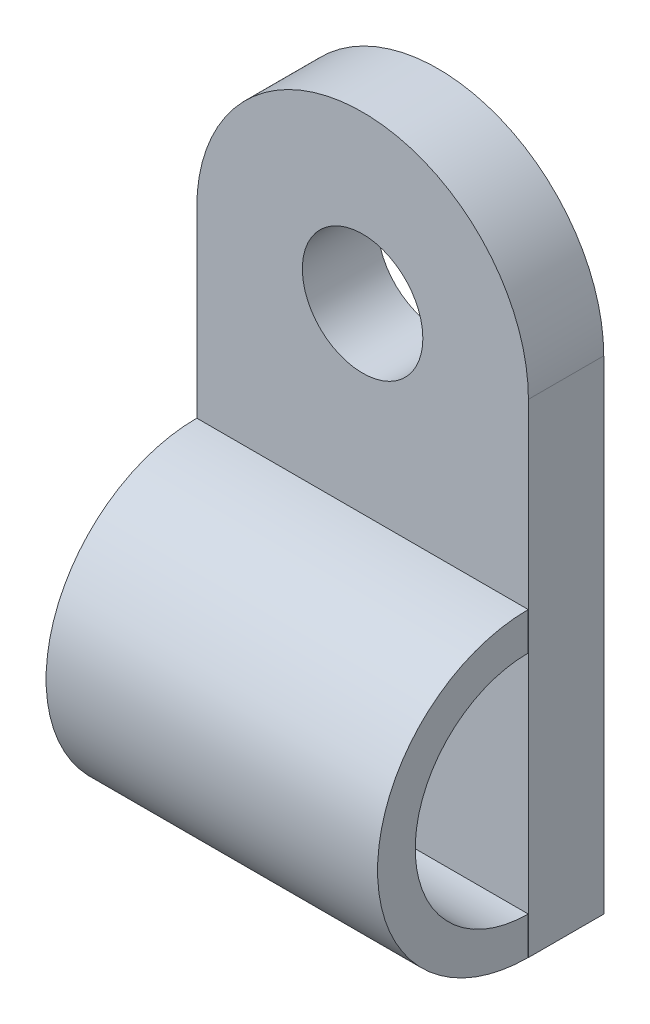
ISO-10303-21;
HEADER;
FILE_DESCRIPTION(('STEP AP214'),'2;1');
FILE_NAME('part.step','',(''),(''),'','','');
FILE_SCHEMA(('AUTOMOTIVE_DESIGN { 1 0 10303 214 1 1 1 1 }'));
ENDSEC;
DATA;
#1=APPLICATION_CONTEXT('core data for automotive mechanical design processes');
#2=APPLICATION_PROTOCOL_DEFINITION('international standard','automotive_design',2000,#1);
#3=PRODUCT_CONTEXT('',#1,'mechanical');
#4=PRODUCT('Part','Part','',(#3));
#5=PRODUCT_RELATED_PRODUCT_CATEGORY('part','',(#4));
#6=PRODUCT_DEFINITION_FORMATION('','',#4);
#7=PRODUCT_DEFINITION_CONTEXT('part definition',#1,'design');
#8=PRODUCT_DEFINITION('design','',#6,#7);
#9=PRODUCT_DEFINITION_SHAPE('','',#8);
#10=(LENGTH_UNIT() NAMED_UNIT(*) SI_UNIT(.MILLI.,.METRE.));
#11=(NAMED_UNIT(*) PLANE_ANGLE_UNIT() SI_UNIT($,.RADIAN.));
#12=(NAMED_UNIT(*) SI_UNIT($,.STERADIAN.) SOLID_ANGLE_UNIT());
#13=UNCERTAINTY_MEASURE_WITH_UNIT(LENGTH_MEASURE(1.E-05),#10,'distance_accuracy_value','');
#14=(GEOMETRIC_REPRESENTATION_CONTEXT(3) GLOBAL_UNCERTAINTY_ASSIGNED_CONTEXT((#13)) GLOBAL_UNIT_ASSIGNED_CONTEXT((#10,
#11,#12)) REPRESENTATION_CONTEXT('',''));
#15=CARTESIAN_POINT('',(0.,0.,0.));
#16=DIRECTION('',(0.,0.,1.));
#17=DIRECTION('',(1.,0.,0.));
#18=AXIS2_PLACEMENT_3D('',#15,#16,#17);
#19=CARTESIAN_POINT('',(0.,0.,2.));
#20=DIRECTION('',(0.,0.,1.));
#21=DIRECTION('',(1.,0.,0.));
#22=AXIS2_PLACEMENT_3D('',#19,#20,#21);
#23=PLANE('',#22);
#24=CARTESIAN_POINT('',(0.,0.,2.));
#25=DIRECTION('',(0.,0.,1.));
#26=DIRECTION('',(1.,0.,0.));
#27=AXIS2_PLACEMENT_3D('',#24,#25,#26);
#28=CIRCLE('',#27,1.6);
#29=CARTESIAN_POINT('',(1.6,0.,2.));
#30=VERTEX_POINT('',#29);
#31=EDGE_CURVE('E136',#30,#30,#28,.T.);
#32=ORIENTED_EDGE('',*,*,#31,.F.);
#33=EDGE_LOOP('',(#32));
#34=FACE_BOUND('',#33,.T.);
#35=DIRECTION('',(0.,1.,0.));
#36=VECTOR('',#35,1.);
#37=CARTESIAN_POINT('',(4.39754831637878,0.,2.));
#38=LINE('',#37,#36);
#39=CARTESIAN_POINT('',(4.39754831637878,-5.83573179517679,2.));
#40=VERTEX_POINT('',#39);
#41=CARTESIAN_POINT('',(4.39754831637878,-4.83573179517679,2.));
#42=VERTEX_POINT('',#41);
#43=EDGE_CURVE('E52',#40,#42,#38,.T.);
#44=ORIENTED_EDGE('',*,*,#43,.F.);
#45=DIRECTION('',(-1.,0.,0.));
#46=VECTOR('',#45,1.);
#47=CARTESIAN_POINT('',(4.39754831637878,-5.83573179517679,2.));
#48=LINE('',#47,#46);
#49=CARTESIAN_POINT('',(-4.40245168362122,-5.83573179517679,2.));
#50=VERTEX_POINT('',#49);
#51=EDGE_CURVE('E129',#40,#50,#48,.T.);
#52=ORIENTED_EDGE('',*,*,#51,.T.);
#53=DIRECTION('',(0.,-1.,0.));
#54=VECTOR('',#53,1.);
#55=CARTESIAN_POINT('',(-4.40245168362122,0.,2.));
#56=LINE('',#55,#54);
#57=CARTESIAN_POINT('',(-4.40245168362122,-11.8357317951768,2.));
#58=VERTEX_POINT('',#57);
#59=EDGE_CURVE('E143',#50,#58,#56,.T.);
#60=ORIENTED_EDGE('',*,*,#59,.T.);
#61=DIRECTION('',(-1.,0.,0.));
#62=VECTOR('',#61,1.);
#63=CARTESIAN_POINT('',(4.39754831637878,-11.8357317951768,2.));
#64=LINE('',#63,#62);
#65=CARTESIAN_POINT('',(4.39754831637878,-11.8357317951768,2.));
#66=VERTEX_POINT('',#65);
#67=EDGE_CURVE('E133',#66,#58,#64,.T.);
#68=ORIENTED_EDGE('',*,*,#67,.F.);
#69=CARTESIAN_POINT('',(4.39754831637878,-12.8357317951768,2.));
#70=VERTEX_POINT('',#69);
#71=EDGE_CURVE('E123',#70,#66,#38,.T.);
#72=ORIENTED_EDGE('',*,*,#71,.F.);
#73=DIRECTION('',(1.,0.,0.));
#74=VECTOR('',#73,1.);
#75=CARTESIAN_POINT('',(0.,-12.8357317951768,2.));
#76=LINE('',#75,#74);
#77=CARTESIAN_POINT('',(4.40245168362122,-12.8357317951768,2.));
#78=VERTEX_POINT('',#77);
#79=EDGE_CURVE('E105',#70,#78,#76,.T.);
#80=ORIENTED_EDGE('',*,*,#79,.T.);
#81=DIRECTION('',(0.,-1.,0.));
#82=VECTOR('',#81,1.);
#83=CARTESIAN_POINT('',(4.40245168362122,0.,2.));
#84=LINE('',#83,#82);
#85=CARTESIAN_POINT('',(4.40245168362122,0.,2.));
#86=VERTEX_POINT('',#85);
#87=EDGE_CURVE('E110',#86,#78,#84,.T.);
#88=ORIENTED_EDGE('',*,*,#87,.F.);
#89=CARTESIAN_POINT('',(0.,0.,2.));
#90=DIRECTION('',(0.,0.,1.));
#91=DIRECTION('',(1.,0.,0.));
#92=AXIS2_PLACEMENT_3D('',#89,#90,#91);
#93=CIRCLE('',#92,4.40245168362122);
#94=CARTESIAN_POINT('',(-4.40245168362122,0.,2.));
#95=VERTEX_POINT('',#94);
#96=EDGE_CURVE('E139',#86,#95,#93,.T.);
#97=ORIENTED_EDGE('',*,*,#96,.T.);
#98=CARTESIAN_POINT('',(-4.40245168362122,-4.83573179517679,2.));
#99=VERTEX_POINT('',#98);
#100=EDGE_CURVE('E144',#95,#99,#56,.T.);
#101=ORIENTED_EDGE('',*,*,#100,.T.);
#102=DIRECTION('',(-1.,0.,0.));
#103=VECTOR('',#102,1.);
#104=CARTESIAN_POINT('',(4.39754831637878,-4.83573179517679,2.));
#105=LINE('',#104,#103);
#106=EDGE_CURVE('E57',#42,#99,#105,.T.);
#107=ORIENTED_EDGE('',*,*,#106,.F.);
#108=EDGE_LOOP('',(#44,#52,#60,#68,#72,#80,#88,#97,#101,#107));
#109=FACE_BOUND('',#108,.T.);
#110=ADVANCED_FACE('F37',(#34,#109),#23,.T.);
#111=CARTESIAN_POINT('',(0.,0.,2.));
#112=DIRECTION('',(0.,0.,-1.));
#113=DIRECTION('',(-1.,0.,0.));
#114=AXIS2_PLACEMENT_3D('',#111,#112,#113);
#115=CYLINDRICAL_SURFACE('',#114,4.40245168362122);
#116=CARTESIAN_POINT('',(0.,0.,0.));
#117=DIRECTION('',(0.,0.,1.));
#118=DIRECTION('',(1.,0.,0.));
#119=AXIS2_PLACEMENT_3D('',#116,#117,#118);
#120=CIRCLE('',#119,4.40245168362122);
#121=CARTESIAN_POINT('',(4.40245168362122,0.,0.));
#122=VERTEX_POINT('',#121);
#123=CARTESIAN_POINT('',(-4.40245168362122,0.,0.));
#124=VERTEX_POINT('',#123);
#125=EDGE_CURVE('E151',#122,#124,#120,.T.);
#126=ORIENTED_EDGE('',*,*,#125,.T.);
#127=DIRECTION('',(0.,0.,-1.));
#128=VECTOR('',#127,1.);
#129=CARTESIAN_POINT('',(-4.40245168362122,0.,2.));
#130=LINE('',#129,#128);
#131=EDGE_CURVE('E11',#95,#124,#130,.T.);
#132=ORIENTED_EDGE('',*,*,#131,.F.);
#133=ORIENTED_EDGE('',*,*,#96,.F.);
#134=DIRECTION('',(0.,0.,-1.));
#135=VECTOR('',#134,1.);
#136=CARTESIAN_POINT('',(4.40245168362122,0.,2.));
#137=LINE('',#136,#135);
#138=EDGE_CURVE('E148',#86,#122,#137,.T.);
#139=ORIENTED_EDGE('',*,*,#138,.T.);
#140=EDGE_LOOP('',(#126,#132,#133,#139));
#141=FACE_BOUND('',#140,.T.);
#142=ADVANCED_FACE('F169',(#141),#115,.T.);
#143=CARTESIAN_POINT('',(-4.40245168362122,0.,2.));
#144=DIRECTION('',(1.,0.,0.));
#145=DIRECTION('',(0.,0.,-1.));
#146=AXIS2_PLACEMENT_3D('',#143,#144,#145);
#147=PLANE('',#146);
#148=CARTESIAN_POINT('',(-4.40245168362122,-8.83573179517679,2.));
#149=DIRECTION('',(-1.,0.,0.));
#150=DIRECTION('',(0.,0.,1.));
#151=AXIS2_PLACEMENT_3D('',#148,#149,#150);
#152=CIRCLE('',#151,4.);
#153=CARTESIAN_POINT('',(-4.40245168362122,-12.8357317951768,2.));
#154=VERTEX_POINT('',#153);
#155=EDGE_CURVE('E116',#154,#99,#152,.T.);
#156=ORIENTED_EDGE('',*,*,#155,.T.);
#157=ORIENTED_EDGE('',*,*,#100,.F.);
#158=ORIENTED_EDGE('',*,*,#131,.T.);
#159=DIRECTION('',(0.,-1.,0.));
#160=VECTOR('',#159,1.);
#161=CARTESIAN_POINT('',(-4.40245168362122,0.,0.));
#162=LINE('',#161,#160);
#163=CARTESIAN_POINT('',(-4.40245168362122,-12.8357317951768,0.));
#164=VERTEX_POINT('',#163);
#165=EDGE_CURVE('E117',#124,#164,#162,.T.);
#166=ORIENTED_EDGE('',*,*,#165,.T.);
#167=DIRECTION('',(0.,0.,-1.));
#168=VECTOR('',#167,1.);
#169=CARTESIAN_POINT('',(-4.40245168362122,-12.8357317951768,2.));
#170=LINE('',#169,#168);
#171=EDGE_CURVE('E45',#154,#164,#170,.T.);
#172=ORIENTED_EDGE('',*,*,#171,.F.);
#173=EDGE_LOOP('',(#156,#157,#158,#166,#172));
#174=FACE_BOUND('',#173,.T.);
#175=ORIENTED_EDGE('',*,*,#59,.F.);
#176=CARTESIAN_POINT('',(-4.40245168362122,-8.83573179517679,2.));
#177=DIRECTION('',(-1.,0.,0.));
#178=DIRECTION('',(0.,0.,1.));
#179=AXIS2_PLACEMENT_3D('',#176,#177,#178);
#180=CIRCLE('',#179,3.);
#181=EDGE_CURVE('E121',#58,#50,#180,.T.);
#182=ORIENTED_EDGE('',*,*,#181,.F.);
#183=EDGE_LOOP('',(#175,#182));
#184=FACE_BOUND('',#183,.T.);
#185=ADVANCED_FACE('F114',(#174,#184),#147,.F.);
#186=CARTESIAN_POINT('',(0.,-12.8357317951768,2.));
#187=DIRECTION('',(0.,1.,0.));
#188=DIRECTION('',(0.,0.,1.));
#189=AXIS2_PLACEMENT_3D('',#186,#187,#188);
#190=PLANE('',#189);
#191=DIRECTION('',(1.,0.,0.));
#192=VECTOR('',#191,1.);
#193=CARTESIAN_POINT('',(0.,-12.8357317951768,0.));
#194=LINE('',#193,#192);
#195=CARTESIAN_POINT('',(4.40245168362122,-12.8357317951768,0.));
#196=VERTEX_POINT('',#195);
#197=EDGE_CURVE('E155',#164,#196,#194,.T.);
#198=ORIENTED_EDGE('',*,*,#197,.T.);
#199=DIRECTION('',(0.,0.,-1.));
#200=VECTOR('',#199,1.);
#201=CARTESIAN_POINT('',(4.40245168362122,-12.8357317951768,2.));
#202=LINE('',#201,#200);
#203=EDGE_CURVE('E118',#78,#196,#202,.T.);
#204=ORIENTED_EDGE('',*,*,#203,.F.);
#205=ORIENTED_EDGE('',*,*,#79,.F.);
#206=EDGE_CURVE('E99',#154,#70,#76,.T.);
#207=ORIENTED_EDGE('',*,*,#206,.F.);
#208=ORIENTED_EDGE('',*,*,#171,.T.);
#209=EDGE_LOOP('',(#198,#204,#205,#207,#208));
#210=FACE_BOUND('',#209,.T.);
#211=ADVANCED_FACE('F102',(#210),#190,.F.);
#212=CARTESIAN_POINT('',(0.,0.,2.));
#213=DIRECTION('',(0.,0.,-1.));
#214=DIRECTION('',(-1.,0.,0.));
#215=AXIS2_PLACEMENT_3D('',#212,#213,#214);
#216=CYLINDRICAL_SURFACE('',#215,1.6);
#217=ORIENTED_EDGE('',*,*,#31,.T.);
#218=EDGE_LOOP('',(#217));
#219=FACE_BOUND('',#218,.T.);
#220=CARTESIAN_POINT('',(0.,0.,0.));
#221=DIRECTION('',(0.,0.,1.));
#222=DIRECTION('',(1.,0.,0.));
#223=AXIS2_PLACEMENT_3D('',#220,#221,#222);
#224=CIRCLE('',#223,1.6);
#225=CARTESIAN_POINT('',(1.6,0.,0.));
#226=VERTEX_POINT('',#225);
#227=EDGE_CURVE('E131',#226,#226,#224,.T.);
#228=ORIENTED_EDGE('',*,*,#227,.F.);
#229=EDGE_LOOP('',(#228));
#230=FACE_BOUND('',#229,.T.);
#231=ADVANCED_FACE('F39',(#219,#230),#216,.F.);
#232=CARTESIAN_POINT('',(4.40245168362122,0.,2.));
#233=DIRECTION('',(1.,0.,0.));
#234=DIRECTION('',(0.,0.,-1.));
#235=AXIS2_PLACEMENT_3D('',#232,#233,#234);
#236=PLANE('',#235);
#237=DIRECTION('',(0.,-1.,0.));
#238=VECTOR('',#237,1.);
#239=CARTESIAN_POINT('',(4.40245168362122,0.,0.));
#240=LINE('',#239,#238);
#241=EDGE_CURVE('E140',#122,#196,#240,.T.);
#242=ORIENTED_EDGE('',*,*,#241,.F.);
#243=ORIENTED_EDGE('',*,*,#138,.F.);
#244=ORIENTED_EDGE('',*,*,#87,.T.);
#245=ORIENTED_EDGE('',*,*,#203,.T.);
#246=EDGE_LOOP('',(#242,#243,#244,#245));
#247=FACE_BOUND('',#246,.T.);
#248=ADVANCED_FACE('F162',(#247),#236,.T.);
#249=CARTESIAN_POINT('',(0.,0.,0.));
#250=DIRECTION('',(0.,0.,1.));
#251=DIRECTION('',(1.,0.,0.));
#252=AXIS2_PLACEMENT_3D('',#249,#250,#251);
#253=PLANE('',#252);
#254=ORIENTED_EDGE('',*,*,#227,.T.);
#255=EDGE_LOOP('',(#254));
#256=FACE_BOUND('',#255,.T.);
#257=ORIENTED_EDGE('',*,*,#125,.F.);
#258=ORIENTED_EDGE('',*,*,#241,.T.);
#259=ORIENTED_EDGE('',*,*,#197,.F.);
#260=ORIENTED_EDGE('',*,*,#165,.F.);
#261=EDGE_LOOP('',(#257,#258,#259,#260));
#262=FACE_BOUND('',#261,.T.);
#263=ADVANCED_FACE('F166',(#256,#262),#253,.F.);
#264=CARTESIAN_POINT('',(4.39754831637878,-8.83573179517679,2.));
#265=DIRECTION('',(-1.,0.,0.));
#266=DIRECTION('',(0.,0.,1.));
#267=AXIS2_PLACEMENT_3D('',#264,#265,#266);
#268=CYLINDRICAL_SURFACE('',#267,3.);
#269=ORIENTED_EDGE('',*,*,#181,.T.);
#270=ORIENTED_EDGE('',*,*,#51,.F.);
#271=CARTESIAN_POINT('',(4.39754831637878,-8.83573179517679,2.));
#272=DIRECTION('',(-1.,0.,0.));
#273=DIRECTION('',(0.,0.,1.));
#274=AXIS2_PLACEMENT_3D('',#271,#272,#273);
#275=CIRCLE('',#274,3.);
#276=EDGE_CURVE('E120',#66,#40,#275,.T.);
#277=ORIENTED_EDGE('',*,*,#276,.F.);
#278=ORIENTED_EDGE('',*,*,#67,.T.);
#279=EDGE_LOOP('',(#269,#270,#277,#278));
#280=FACE_BOUND('',#279,.T.);
#281=ADVANCED_FACE('F179',(#280),#268,.F.);
#282=CARTESIAN_POINT('',(4.39754831637878,-8.83573179517679,2.));
#283=DIRECTION('',(-1.,0.,0.));
#284=DIRECTION('',(0.,0.,1.));
#285=AXIS2_PLACEMENT_3D('',#282,#283,#284);
#286=CYLINDRICAL_SURFACE('',#285,4.);
#287=ORIENTED_EDGE('',*,*,#155,.F.);
#288=ORIENTED_EDGE('',*,*,#206,.T.);
#289=CARTESIAN_POINT('',(4.39754831637878,-8.83573179517679,2.));
#290=DIRECTION('',(-1.,0.,0.));
#291=DIRECTION('',(0.,0.,1.));
#292=AXIS2_PLACEMENT_3D('',#289,#290,#291);
#293=CIRCLE('',#292,4.);
#294=EDGE_CURVE('E174',#70,#42,#293,.T.);
#295=ORIENTED_EDGE('',*,*,#294,.T.);
#296=ORIENTED_EDGE('',*,*,#106,.T.);
#297=EDGE_LOOP('',(#287,#288,#295,#296));
#298=FACE_BOUND('',#297,.T.);
#299=ADVANCED_FACE('F119',(#298),#286,.T.);
#300=CARTESIAN_POINT('',(4.39754831637878,0.,0.));
#301=DIRECTION('',(-1.,0.,0.));
#302=DIRECTION('',(0.,0.,1.));
#303=AXIS2_PLACEMENT_3D('',#300,#301,#302);
#304=PLANE('',#303);
#305=ORIENTED_EDGE('',*,*,#276,.T.);
#306=ORIENTED_EDGE('',*,*,#43,.T.);
#307=ORIENTED_EDGE('',*,*,#294,.F.);
#308=ORIENTED_EDGE('',*,*,#71,.T.);
#309=EDGE_LOOP('',(#305,#306,#307,#308));
#310=FACE_BOUND('',#309,.T.);
#311=ADVANCED_FACE('F176',(#310),#304,.F.);
#312=CLOSED_SHELL('',(#110,#142,#185,#211,#231,#248,#263,#281,#299,#311));
#313=MANIFOLD_SOLID_BREP('B2',#312);
#314=ADVANCED_BREP_SHAPE_REPRESENTATION('',(#18,#313),#14);
#315=SHAPE_DEFINITION_REPRESENTATION(#9,#314);
ENDSEC;
END-ISO-10303-21;
